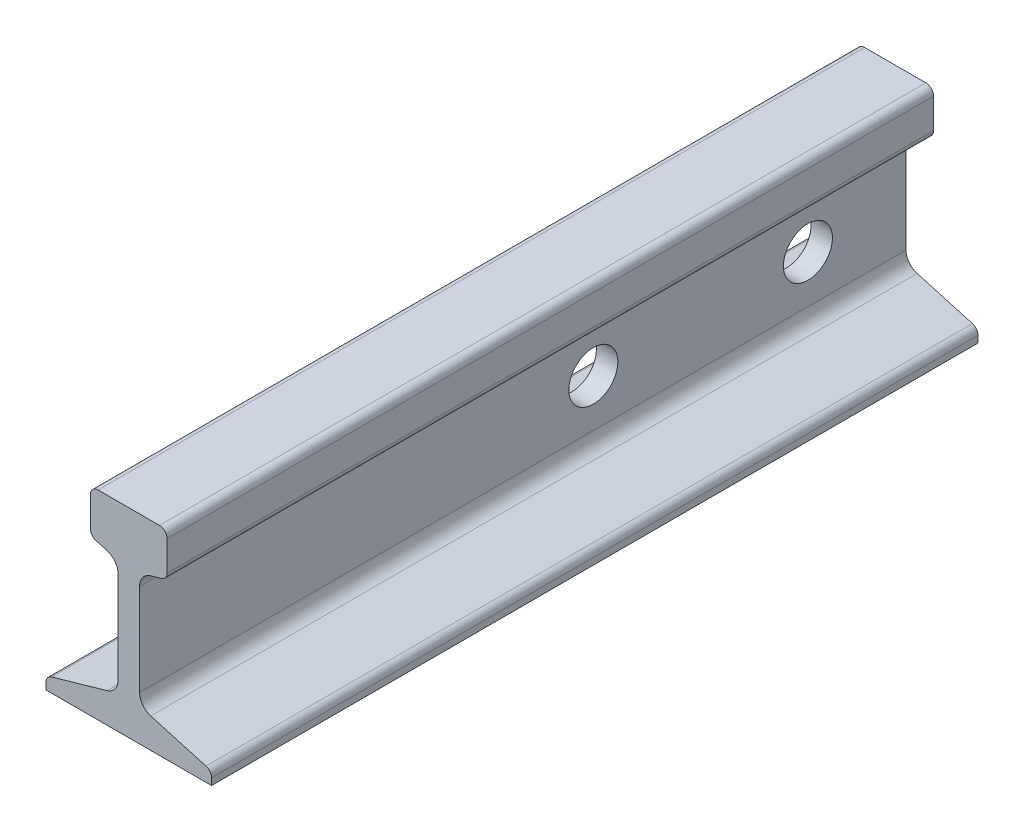
ISO-10303-21;
HEADER;
FILE_DESCRIPTION(('STEP AP214'),'2;1');
FILE_NAME('part.step','',(''),(''),'','','');
FILE_SCHEMA(('AUTOMOTIVE_DESIGN { 1 0 10303 214 1 1 1 1 }'));
ENDSEC;
DATA;
#1=APPLICATION_CONTEXT('core data for automotive mechanical design processes');
#2=APPLICATION_PROTOCOL_DEFINITION('international standard','automotive_design',2000,#1);
#3=PRODUCT_CONTEXT('',#1,'mechanical');
#4=PRODUCT('Part','Part','',(#3));
#5=PRODUCT_RELATED_PRODUCT_CATEGORY('part','',(#4));
#6=PRODUCT_DEFINITION_FORMATION('','',#4);
#7=PRODUCT_DEFINITION_CONTEXT('part definition',#1,'design');
#8=PRODUCT_DEFINITION('design','',#6,#7);
#9=PRODUCT_DEFINITION_SHAPE('','',#8);
#10=(LENGTH_UNIT() NAMED_UNIT(*) SI_UNIT(.MILLI.,.METRE.));
#11=(NAMED_UNIT(*) PLANE_ANGLE_UNIT() SI_UNIT($,.RADIAN.));
#12=(NAMED_UNIT(*) SI_UNIT($,.STERADIAN.) SOLID_ANGLE_UNIT());
#13=UNCERTAINTY_MEASURE_WITH_UNIT(LENGTH_MEASURE(1.E-05),#10,'distance_accuracy_value','');
#14=(GEOMETRIC_REPRESENTATION_CONTEXT(3) GLOBAL_UNCERTAINTY_ASSIGNED_CONTEXT((#13)) GLOBAL_UNIT_ASSIGNED_CONTEXT((#10,
#11,#12)) REPRESENTATION_CONTEXT('',''));
#15=CARTESIAN_POINT('',(0.,0.,0.));
#16=DIRECTION('',(0.,0.,1.));
#17=DIRECTION('',(1.,0.,0.));
#18=AXIS2_PLACEMENT_3D('',#15,#16,#17);
#19=CARTESIAN_POINT('',(37.,62.5,250.));
#20=DIRECTION('',(0.,0.,-1.));
#21=DIRECTION('',(-1.,0.,0.));
#22=AXIS2_PLACEMENT_3D('',#19,#20,#21);
#23=CYLINDRICAL_SURFACE('',#22,2.5);
#24=CARTESIAN_POINT('',(37.,62.5,0.));
#25=DIRECTION('',(0.,0.,1.));
#26=DIRECTION('',(1.,0.,0.));
#27=AXIS2_PLACEMENT_3D('',#24,#25,#26);
#28=CIRCLE('',#27,2.5);
#29=CARTESIAN_POINT('',(39.5,62.5,0.));
#30=VERTEX_POINT('',#29);
#31=CARTESIAN_POINT('',(37.,65.,0.));
#32=VERTEX_POINT('',#31);
#33=EDGE_CURVE('E218',#30,#32,#28,.T.);
#34=ORIENTED_EDGE('',*,*,#33,.T.);
#35=DIRECTION('',(0.,0.,-1.));
#36=VECTOR('',#35,1.);
#37=CARTESIAN_POINT('',(37.,65.,250.));
#38=LINE('',#37,#36);
#39=CARTESIAN_POINT('',(37.,65.,250.));
#40=VERTEX_POINT('',#39);
#41=EDGE_CURVE('E11',#40,#32,#38,.T.);
#42=ORIENTED_EDGE('',*,*,#41,.F.);
#43=CARTESIAN_POINT('',(37.,62.5,250.));
#44=DIRECTION('',(0.,0.,1.));
#45=DIRECTION('',(1.,0.,0.));
#46=AXIS2_PLACEMENT_3D('',#43,#44,#45);
#47=CIRCLE('',#46,2.5);
#48=CARTESIAN_POINT('',(39.5,62.5,250.));
#49=VERTEX_POINT('',#48);
#50=EDGE_CURVE('E133',#49,#40,#47,.T.);
#51=ORIENTED_EDGE('',*,*,#50,.F.);
#52=DIRECTION('',(0.,0.,-1.));
#53=VECTOR('',#52,1.);
#54=CARTESIAN_POINT('',(39.5,62.5,250.));
#55=LINE('',#54,#53);
#56=EDGE_CURVE('E54',#49,#30,#55,.T.);
#57=ORIENTED_EDGE('',*,*,#56,.T.);
#58=EDGE_LOOP('',(#34,#42,#51,#57));
#59=FACE_BOUND('',#58,.T.);
#60=ADVANCED_FACE('F36',(#59),#23,.T.);
#61=CARTESIAN_POINT('',(17.,65.,250.));
#62=DIRECTION('',(0.,1.,0.));
#63=DIRECTION('',(0.,0.,1.));
#64=AXIS2_PLACEMENT_3D('',#61,#62,#63);
#65=PLANE('',#64);
#66=DIRECTION('',(1.,0.,0.));
#67=VECTOR('',#66,1.);
#68=CARTESIAN_POINT('',(17.,65.,0.));
#69=LINE('',#68,#67);
#70=CARTESIAN_POINT('',(17.,65.,0.));
#71=VERTEX_POINT('',#70);
#72=EDGE_CURVE('E220',#71,#32,#69,.T.);
#73=ORIENTED_EDGE('',*,*,#72,.F.);
#74=DIRECTION('',(0.,0.,-1.));
#75=VECTOR('',#74,1.);
#76=CARTESIAN_POINT('',(17.,65.,250.));
#77=LINE('',#76,#75);
#78=CARTESIAN_POINT('',(17.,65.,250.));
#79=VERTEX_POINT('',#78);
#80=EDGE_CURVE('E45',#79,#71,#77,.T.);
#81=ORIENTED_EDGE('',*,*,#80,.F.);
#82=DIRECTION('',(1.,0.,0.));
#83=VECTOR('',#82,1.);
#84=CARTESIAN_POINT('',(17.,65.,250.));
#85=LINE('',#84,#83);
#86=EDGE_CURVE('E329',#79,#40,#85,.T.);
#87=ORIENTED_EDGE('',*,*,#86,.T.);
#88=ORIENTED_EDGE('',*,*,#41,.T.);
#89=EDGE_LOOP('',(#73,#81,#87,#88));
#90=FACE_BOUND('',#89,.T.);
#91=ADVANCED_FACE('F395',(#90),#65,.T.);
#92=CARTESIAN_POINT('',(17.,62.5,250.));
#93=DIRECTION('',(0.,0.,-1.));
#94=DIRECTION('',(-1.,0.,0.));
#95=AXIS2_PLACEMENT_3D('',#92,#93,#94);
#96=CYLINDRICAL_SURFACE('',#95,2.5);
#97=CARTESIAN_POINT('',(17.,62.5,0.));
#98=DIRECTION('',(0.,0.,-1.));
#99=DIRECTION('',(-1.,0.,0.));
#100=AXIS2_PLACEMENT_3D('',#97,#98,#99);
#101=CIRCLE('',#100,2.5);
#102=CARTESIAN_POINT('',(14.5,62.5,0.));
#103=VERTEX_POINT('',#102);
#104=EDGE_CURVE('E224',#103,#71,#101,.T.);
#105=ORIENTED_EDGE('',*,*,#104,.F.);
#106=DIRECTION('',(0.,0.,-1.));
#107=VECTOR('',#106,1.);
#108=CARTESIAN_POINT('',(14.5,62.5,250.));
#109=LINE('',#108,#107);
#110=CARTESIAN_POINT('',(14.5,62.5,250.));
#111=VERTEX_POINT('',#110);
#112=EDGE_CURVE('E313',#111,#103,#109,.T.);
#113=ORIENTED_EDGE('',*,*,#112,.F.);
#114=CARTESIAN_POINT('',(17.,62.5,250.));
#115=DIRECTION('',(0.,0.,-1.));
#116=DIRECTION('',(-1.,0.,0.));
#117=AXIS2_PLACEMENT_3D('',#114,#115,#116);
#118=CIRCLE('',#117,2.5);
#119=EDGE_CURVE('E332',#111,#79,#118,.T.);
#120=ORIENTED_EDGE('',*,*,#119,.T.);
#121=ORIENTED_EDGE('',*,*,#80,.T.);
#122=EDGE_LOOP('',(#105,#113,#120,#121));
#123=FACE_BOUND('',#122,.T.);
#124=ADVANCED_FACE('F399',(#123),#96,.T.);
#125=CARTESIAN_POINT('',(14.5,62.5,250.));
#126=DIRECTION('',(1.,0.,0.));
#127=DIRECTION('',(0.,0.,-1.));
#128=AXIS2_PLACEMENT_3D('',#125,#126,#127);
#129=PLANE('',#128);
#130=DIRECTION('',(0.,-1.,0.));
#131=VECTOR('',#130,1.);
#132=CARTESIAN_POINT('',(14.5,62.5,0.));
#133=LINE('',#132,#131);
#134=CARTESIAN_POINT('',(14.5,52.7447850054955,0.));
#135=VERTEX_POINT('',#134);
#136=EDGE_CURVE('E227',#103,#135,#133,.T.);
#137=ORIENTED_EDGE('',*,*,#136,.T.);
#138=DIRECTION('',(0.,0.,-1.));
#139=VECTOR('',#138,1.);
#140=CARTESIAN_POINT('',(14.5,52.7447850054955,250.));
#141=LINE('',#140,#139);
#142=CARTESIAN_POINT('',(14.5,52.7447850054955,250.));
#143=VERTEX_POINT('',#142);
#144=EDGE_CURVE('E310',#143,#135,#141,.T.);
#145=ORIENTED_EDGE('',*,*,#144,.F.);
#146=DIRECTION('',(0.,-1.,0.));
#147=VECTOR('',#146,1.);
#148=CARTESIAN_POINT('',(14.5,62.5,250.));
#149=LINE('',#148,#147);
#150=EDGE_CURVE('E335',#111,#143,#149,.T.);
#151=ORIENTED_EDGE('',*,*,#150,.F.);
#152=ORIENTED_EDGE('',*,*,#112,.T.);
#153=EDGE_LOOP('',(#137,#145,#151,#152));
#154=FACE_BOUND('',#153,.T.);
#155=ADVANCED_FACE('F409',(#154),#129,.F.);
#156=CARTESIAN_POINT('',(17.,52.7447850054955,250.));
#157=DIRECTION('',(0.,0.,-1.));
#158=DIRECTION('',(-1.,0.,0.));
#159=AXIS2_PLACEMENT_3D('',#156,#157,#158);
#160=CYLINDRICAL_SURFACE('',#159,2.5);
#161=CARTESIAN_POINT('',(17.,52.7447850054955,0.));
#162=DIRECTION('',(0.,0.,1.));
#163=DIRECTION('',(1.,0.,0.));
#164=AXIS2_PLACEMENT_3D('',#161,#162,#163);
#165=CIRCLE('',#164,2.5);
#166=CARTESIAN_POINT('',(16.3131971802566,50.3409751363935,0.));
#167=VERTEX_POINT('',#166);
#168=EDGE_CURVE('E229',#135,#167,#165,.T.);
#169=ORIENTED_EDGE('',*,*,#168,.T.);
#170=DIRECTION('',(0.,0.,-1.));
#171=VECTOR('',#170,1.);
#172=CARTESIAN_POINT('',(16.3131971802566,50.3409751363935,250.));
#173=LINE('',#172,#171);
#174=CARTESIAN_POINT('',(16.3131971802566,50.3409751363935,250.));
#175=VERTEX_POINT('',#174);
#176=EDGE_CURVE('E308',#175,#167,#173,.T.);
#177=ORIENTED_EDGE('',*,*,#176,.F.);
#178=CARTESIAN_POINT('',(17.,52.7447850054955,250.));
#179=DIRECTION('',(0.,0.,1.));
#180=DIRECTION('',(1.,0.,0.));
#181=AXIS2_PLACEMENT_3D('',#178,#179,#180);
#182=CIRCLE('',#181,2.5);
#183=EDGE_CURVE('E337',#143,#175,#182,.T.);
#184=ORIENTED_EDGE('',*,*,#183,.F.);
#185=ORIENTED_EDGE('',*,*,#144,.T.);
#186=EDGE_LOOP('',(#169,#177,#184,#185));
#187=FACE_BOUND('',#186,.T.);
#188=ADVANCED_FACE('F415',(#187),#160,.T.);
#189=CARTESIAN_POINT('',(19.9002970874221,49.3160894486319,250.));
#190=DIRECTION('',(-0.274721127897379,-0.961523947640823,0.));
#191=DIRECTION('',(0.961523947640823,-0.274721127897379,0.));
#192=AXIS2_PLACEMENT_3D('',#189,#190,#191);
#193=PLANE('',#192);
#194=DIRECTION('',(-0.961523947640823,0.274721127897379,0.));
#195=VECTOR('',#194,1.);
#196=CARTESIAN_POINT('',(19.9002970874221,49.3160894486319,0.));
#197=LINE('',#196,#195);
#198=CARTESIAN_POINT('',(19.9002970874221,49.3160894486319,0.));
#199=VERTEX_POINT('',#198);
#200=EDGE_CURVE('E232',#199,#167,#197,.T.);
#201=ORIENTED_EDGE('',*,*,#200,.F.);
#202=DIRECTION('',(0.,0.,-1.));
#203=VECTOR('',#202,1.);
#204=CARTESIAN_POINT('',(19.9002970874221,49.3160894486319,250.));
#205=LINE('',#204,#203);
#206=CARTESIAN_POINT('',(19.9002970874221,49.3160894486319,250.));
#207=VERTEX_POINT('',#206);
#208=EDGE_CURVE('E306',#207,#199,#205,.T.);
#209=ORIENTED_EDGE('',*,*,#208,.F.);
#210=DIRECTION('',(-0.961523947640823,0.274721127897379,0.));
#211=VECTOR('',#210,1.);
#212=CARTESIAN_POINT('',(19.9002970874221,49.3160894486319,250.));
#213=LINE('',#212,#211);
#214=EDGE_CURVE('E339',#207,#175,#213,.T.);
#215=ORIENTED_EDGE('',*,*,#214,.T.);
#216=ORIENTED_EDGE('',*,*,#176,.T.);
#217=EDGE_LOOP('',(#201,#209,#215,#216));
#218=FACE_BOUND('',#217,.T.);
#219=ADVANCED_FACE('F419',(#218),#193,.T.);
#220=CARTESIAN_POINT('',(18.5266914479352,44.5084697104278,250.));
#221=DIRECTION('',(0.,0.,-1.));
#222=DIRECTION('',(-1.,0.,0.));
#223=AXIS2_PLACEMENT_3D('',#220,#221,#222);
#224=CYLINDRICAL_SURFACE('',#223,5.);
#225=CARTESIAN_POINT('',(18.5266914479352,44.5084697104278,0.));
#226=DIRECTION('',(0.,0.,1.));
#227=DIRECTION('',(1.,0.,0.));
#228=AXIS2_PLACEMENT_3D('',#225,#226,#227);
#229=CIRCLE('',#228,5.);
#230=CARTESIAN_POINT('',(23.5266914479352,44.5084697104277,0.));
#231=VERTEX_POINT('',#230);
#232=EDGE_CURVE('E235',#231,#199,#229,.T.);
#233=ORIENTED_EDGE('',*,*,#232,.F.);
#234=DIRECTION('',(0.,0.,-1.));
#235=VECTOR('',#234,1.);
#236=CARTESIAN_POINT('',(23.5266914479352,44.5084697104277,250.));
#237=LINE('',#236,#235);
#238=CARTESIAN_POINT('',(23.5266914479352,44.5084697104277,250.));
#239=VERTEX_POINT('',#238);
#240=EDGE_CURVE('E304',#239,#231,#237,.T.);
#241=ORIENTED_EDGE('',*,*,#240,.F.);
#242=CARTESIAN_POINT('',(18.5266914479352,44.5084697104278,250.));
#243=DIRECTION('',(0.,0.,1.));
#244=DIRECTION('',(1.,0.,0.));
#245=AXIS2_PLACEMENT_3D('',#242,#243,#244);
#246=CIRCLE('',#245,5.);
#247=EDGE_CURVE('E342',#239,#207,#246,.T.);
#248=ORIENTED_EDGE('',*,*,#247,.T.);
#249=ORIENTED_EDGE('',*,*,#208,.T.);
#250=EDGE_LOOP('',(#233,#241,#248,#249));
#251=FACE_BOUND('',#250,.T.);
#252=ADVANCED_FACE('F422',(#251),#224,.F.);
#253=CARTESIAN_POINT('',(23.5266914479352,44.5084697104277,250.));
#254=DIRECTION('',(1.,0.,0.));
#255=DIRECTION('',(0.,0.,-1.));
#256=AXIS2_PLACEMENT_3D('',#253,#254,#255);
#257=PLANE('',#256);
#258=CARTESIAN_POINT('',(23.5266914479352,30.,32.));
#259=DIRECTION('',(1.,0.,0.));
#260=DIRECTION('',(0.,0.,-1.));
#261=AXIS2_PLACEMENT_3D('',#258,#259,#260);
#262=CIRCLE('',#261,8.);
#263=CARTESIAN_POINT('',(23.5266914479352,30.,24.));
#264=VERTEX_POINT('',#263);
#265=EDGE_CURVE('E221',#264,#264,#262,.F.);
#266=ORIENTED_EDGE('',*,*,#265,.F.);
#267=EDGE_LOOP('',(#266));
#268=FACE_BOUND('',#267,.T.);
#269=CARTESIAN_POINT('',(23.5266914479352,30.,102.));
#270=DIRECTION('',(1.,0.,0.));
#271=DIRECTION('',(0.,0.,-1.));
#272=AXIS2_PLACEMENT_3D('',#269,#270,#271);
#273=CIRCLE('',#272,8.);
#274=CARTESIAN_POINT('',(23.5266914479352,30.,94.));
#275=VERTEX_POINT('',#274);
#276=EDGE_CURVE('E317',#275,#275,#273,.F.);
#277=ORIENTED_EDGE('',*,*,#276,.F.);
#278=EDGE_LOOP('',(#277));
#279=FACE_BOUND('',#278,.T.);
#280=DIRECTION('',(0.,-1.,0.));
#281=VECTOR('',#280,1.);
#282=CARTESIAN_POINT('',(23.5266914479352,44.5084697104277,0.));
#283=LINE('',#282,#281);
#284=CARTESIAN_POINT('',(23.5266914479352,14.5721041327756,0.));
#285=VERTEX_POINT('',#284);
#286=EDGE_CURVE('E238',#231,#285,#283,.T.);
#287=ORIENTED_EDGE('',*,*,#286,.T.);
#288=DIRECTION('',(0.,0.,-1.));
#289=VECTOR('',#288,1.);
#290=CARTESIAN_POINT('',(23.5266914479352,14.5721041327756,250.));
#291=LINE('',#290,#289);
#292=CARTESIAN_POINT('',(23.5266914479352,14.5721041327756,250.));
#293=VERTEX_POINT('',#292);
#294=EDGE_CURVE('E301',#293,#285,#291,.T.);
#295=ORIENTED_EDGE('',*,*,#294,.F.);
#296=DIRECTION('',(0.,-1.,0.));
#297=VECTOR('',#296,1.);
#298=CARTESIAN_POINT('',(23.5266914479352,44.5084697104277,250.));
#299=LINE('',#298,#297);
#300=EDGE_CURVE('E345',#239,#293,#299,.T.);
#301=ORIENTED_EDGE('',*,*,#300,.F.);
#302=ORIENTED_EDGE('',*,*,#240,.T.);
#303=EDGE_LOOP('',(#287,#295,#301,#302));
#304=FACE_BOUND('',#303,.T.);
#305=ADVANCED_FACE('F428',(#268,#279,#304),#257,.F.);
#306=CARTESIAN_POINT('',(18.5266914479352,14.5721041327756,250.));
#307=DIRECTION('',(0.,0.,-1.));
#308=DIRECTION('',(-1.,0.,0.));
#309=AXIS2_PLACEMENT_3D('',#306,#307,#308);
#310=CYLINDRICAL_SURFACE('',#309,5.);
#311=CARTESIAN_POINT('',(18.5266914479352,14.5721041327756,0.));
#312=DIRECTION('',(0.,0.,-1.));
#313=DIRECTION('',(-1.,0.,0.));
#314=AXIS2_PLACEMENT_3D('',#311,#312,#313);
#315=CIRCLE('',#314,5.);
#316=CARTESIAN_POINT('',(19.9002970874221,9.76448439457145,0.));
#317=VERTEX_POINT('',#316);
#318=EDGE_CURVE('E240',#285,#317,#315,.T.);
#319=ORIENTED_EDGE('',*,*,#318,.T.);
#320=DIRECTION('',(0.,0.,-1.));
#321=VECTOR('',#320,1.);
#322=CARTESIAN_POINT('',(19.9002970874221,9.76448439457145,250.));
#323=LINE('',#322,#321);
#324=CARTESIAN_POINT('',(19.9002970874221,9.76448439457145,250.));
#325=VERTEX_POINT('',#324);
#326=EDGE_CURVE('E298',#325,#317,#323,.T.);
#327=ORIENTED_EDGE('',*,*,#326,.F.);
#328=CARTESIAN_POINT('',(18.5266914479352,14.5721041327756,250.));
#329=DIRECTION('',(0.,0.,-1.));
#330=DIRECTION('',(-1.,0.,0.));
#331=AXIS2_PLACEMENT_3D('',#328,#329,#330);
#332=CIRCLE('',#331,5.);
#333=EDGE_CURVE('E347',#293,#325,#332,.T.);
#334=ORIENTED_EDGE('',*,*,#333,.F.);
#335=ORIENTED_EDGE('',*,*,#294,.T.);
#336=EDGE_LOOP('',(#319,#327,#334,#335));
#337=FACE_BOUND('',#336,.T.);
#338=ADVANCED_FACE('F432',(#337),#310,.F.);
#339=CARTESIAN_POINT('',(19.9002970874221,9.76448439457145,250.));
#340=DIRECTION('',(0.274721127897379,-0.961523947640823,0.));
#341=DIRECTION('',(0.961523947640823,0.274721127897379,0.));
#342=AXIS2_PLACEMENT_3D('',#339,#340,#341);
#343=PLANE('',#342);
#344=DIRECTION('',(-0.961523947640823,-0.274721127897379,0.));
#345=VECTOR('',#344,1.);
#346=CARTESIAN_POINT('',(19.9002970874221,9.76448439457145,0.));
#347=LINE('',#346,#345);
#348=CARTESIAN_POINT('',(1.81319718025657,4.59674156395273,0.));
#349=VERTEX_POINT('',#348);
#350=EDGE_CURVE('E242',#317,#349,#347,.T.);
#351=ORIENTED_EDGE('',*,*,#350,.T.);
#352=DIRECTION('',(0.,0.,-1.));
#353=VECTOR('',#352,1.);
#354=CARTESIAN_POINT('',(1.81319718025657,4.59674156395273,250.));
#355=LINE('',#354,#353);
#356=CARTESIAN_POINT('',(1.81319718025657,4.59674156395273,250.));
#357=VERTEX_POINT('',#356);
#358=EDGE_CURVE('E295',#357,#349,#355,.T.);
#359=ORIENTED_EDGE('',*,*,#358,.F.);
#360=DIRECTION('',(-0.961523947640823,-0.274721127897379,0.));
#361=VECTOR('',#360,1.);
#362=CARTESIAN_POINT('',(19.9002970874221,9.76448439457145,250.));
#363=LINE('',#362,#361);
#364=EDGE_CURVE('E349',#325,#357,#363,.T.);
#365=ORIENTED_EDGE('',*,*,#364,.F.);
#366=ORIENTED_EDGE('',*,*,#326,.T.);
#367=EDGE_LOOP('',(#351,#359,#365,#366));
#368=FACE_BOUND('',#367,.T.);
#369=ADVANCED_FACE('F437',(#368),#343,.F.);
#370=CARTESIAN_POINT('',(2.5,2.19293169485067,250.));
#371=DIRECTION('',(0.,0.,-1.));
#372=DIRECTION('',(-1.,0.,0.));
#373=AXIS2_PLACEMENT_3D('',#370,#371,#372);
#374=CYLINDRICAL_SURFACE('',#373,2.5);
#375=CARTESIAN_POINT('',(2.5,2.19293169485067,0.));
#376=DIRECTION('',(0.,0.,1.));
#377=DIRECTION('',(1.,0.,0.));
#378=AXIS2_PLACEMENT_3D('',#375,#376,#377);
#379=CIRCLE('',#378,2.5);
#380=CARTESIAN_POINT('',(0.,2.19293169485066,0.));
#381=VERTEX_POINT('',#380);
#382=EDGE_CURVE('E244',#349,#381,#379,.T.);
#383=ORIENTED_EDGE('',*,*,#382,.T.);
#384=DIRECTION('',(0.,0.,-1.));
#385=VECTOR('',#384,1.);
#386=CARTESIAN_POINT('',(0.,2.19293169485066,250.));
#387=LINE('',#386,#385);
#388=CARTESIAN_POINT('',(0.,2.19293169485066,250.));
#389=VERTEX_POINT('',#388);
#390=EDGE_CURVE('E293',#389,#381,#387,.T.);
#391=ORIENTED_EDGE('',*,*,#390,.F.);
#392=CARTESIAN_POINT('',(2.5,2.19293169485067,250.));
#393=DIRECTION('',(0.,0.,1.));
#394=DIRECTION('',(1.,0.,0.));
#395=AXIS2_PLACEMENT_3D('',#392,#393,#394);
#396=CIRCLE('',#395,2.5);
#397=EDGE_CURVE('E351',#357,#389,#396,.T.);
#398=ORIENTED_EDGE('',*,*,#397,.F.);
#399=ORIENTED_EDGE('',*,*,#358,.T.);
#400=EDGE_LOOP('',(#383,#391,#398,#399));
#401=FACE_BOUND('',#400,.T.);
#402=ADVANCED_FACE('F442',(#401),#374,.T.);
#403=CARTESIAN_POINT('',(0.,0.,250.));
#404=DIRECTION('',(-1.,0.,0.));
#405=DIRECTION('',(0.,0.,1.));
#406=AXIS2_PLACEMENT_3D('',#403,#404,#405);
#407=PLANE('',#406);
#408=DIRECTION('',(0.,1.,0.));
#409=VECTOR('',#408,1.);
#410=CARTESIAN_POINT('',(0.,0.,0.));
#411=LINE('',#410,#409);
#412=CARTESIAN_POINT('',(0.,0.,0.));
#413=VERTEX_POINT('',#412);
#414=EDGE_CURVE('E247',#413,#381,#411,.T.);
#415=ORIENTED_EDGE('',*,*,#414,.F.);
#416=DIRECTION('',(0.,0.,-1.));
#417=VECTOR('',#416,1.);
#418=CARTESIAN_POINT('',(0.,0.,250.));
#419=LINE('',#418,#417);
#420=CARTESIAN_POINT('',(0.,0.,250.));
#421=VERTEX_POINT('',#420);
#422=EDGE_CURVE('E291',#421,#413,#419,.T.);
#423=ORIENTED_EDGE('',*,*,#422,.F.);
#424=DIRECTION('',(0.,1.,0.));
#425=VECTOR('',#424,1.);
#426=CARTESIAN_POINT('',(0.,0.,250.));
#427=LINE('',#426,#425);
#428=EDGE_CURVE('E353',#421,#389,#427,.T.);
#429=ORIENTED_EDGE('',*,*,#428,.T.);
#430=ORIENTED_EDGE('',*,*,#390,.T.);
#431=EDGE_LOOP('',(#415,#423,#429,#430));
#432=FACE_BOUND('',#431,.T.);
#433=ADVANCED_FACE('F446',(#432),#407,.T.);
#434=CARTESIAN_POINT('',(0.,0.,250.));
#435=DIRECTION('',(0.,1.,0.));
#436=DIRECTION('',(0.,0.,1.));
#437=AXIS2_PLACEMENT_3D('',#434,#435,#436);
#438=PLANE('',#437);
#439=DIRECTION('',(1.,0.,0.));
#440=VECTOR('',#439,1.);
#441=CARTESIAN_POINT('',(0.,0.,0.));
#442=LINE('',#441,#440);
#443=CARTESIAN_POINT('',(54.,0.,0.));
#444=VERTEX_POINT('',#443);
#445=EDGE_CURVE('E250',#413,#444,#442,.T.);
#446=ORIENTED_EDGE('',*,*,#445,.T.);
#447=DIRECTION('',(0.,0.,-1.));
#448=VECTOR('',#447,1.);
#449=CARTESIAN_POINT('',(54.,0.,250.));
#450=LINE('',#449,#448);
#451=CARTESIAN_POINT('',(54.,0.,250.));
#452=VERTEX_POINT('',#451);
#453=EDGE_CURVE('E289',#452,#444,#450,.T.);
#454=ORIENTED_EDGE('',*,*,#453,.F.);
#455=DIRECTION('',(1.,0.,0.));
#456=VECTOR('',#455,1.);
#457=CARTESIAN_POINT('',(0.,0.,250.));
#458=LINE('',#457,#456);
#459=EDGE_CURVE('E356',#421,#452,#458,.T.);
#460=ORIENTED_EDGE('',*,*,#459,.F.);
#461=ORIENTED_EDGE('',*,*,#422,.T.);
#462=EDGE_LOOP('',(#446,#454,#460,#461));
#463=FACE_BOUND('',#462,.T.);
#464=ADVANCED_FACE('F451',(#463),#438,.F.);
#465=CARTESIAN_POINT('',(54.,2.19293169485066,250.));
#466=DIRECTION('',(1.,0.,0.));
#467=DIRECTION('',(0.,0.,-1.));
#468=AXIS2_PLACEMENT_3D('',#465,#466,#467);
#469=PLANE('',#468);
#470=DIRECTION('',(0.,-1.,0.));
#471=VECTOR('',#470,1.);
#472=CARTESIAN_POINT('',(54.,2.19293169485066,0.));
#473=LINE('',#472,#471);
#474=CARTESIAN_POINT('',(54.,2.19293169485066,0.));
#475=VERTEX_POINT('',#474);
#476=EDGE_CURVE('E253',#475,#444,#473,.T.);
#477=ORIENTED_EDGE('',*,*,#476,.F.);
#478=DIRECTION('',(0.,0.,-1.));
#479=VECTOR('',#478,1.);
#480=CARTESIAN_POINT('',(54.,2.19293169485066,250.));
#481=LINE('',#480,#479);
#482=CARTESIAN_POINT('',(54.,2.19293169485066,250.));
#483=VERTEX_POINT('',#482);
#484=EDGE_CURVE('E287',#483,#475,#481,.T.);
#485=ORIENTED_EDGE('',*,*,#484,.F.);
#486=DIRECTION('',(0.,-1.,0.));
#487=VECTOR('',#486,1.);
#488=CARTESIAN_POINT('',(54.,2.19293169485066,250.));
#489=LINE('',#488,#487);
#490=EDGE_CURVE('E358',#483,#452,#489,.T.);
#491=ORIENTED_EDGE('',*,*,#490,.T.);
#492=ORIENTED_EDGE('',*,*,#453,.T.);
#493=EDGE_LOOP('',(#477,#485,#491,#492));
#494=FACE_BOUND('',#493,.T.);
#495=ADVANCED_FACE('F457',(#494),#469,.T.);
#496=CARTESIAN_POINT('',(51.5,2.19293169485067,250.));
#497=DIRECTION('',(0.,0.,-1.));
#498=DIRECTION('',(-1.,0.,0.));
#499=AXIS2_PLACEMENT_3D('',#496,#497,#498);
#500=CYLINDRICAL_SURFACE('',#499,2.5);
#501=CARTESIAN_POINT('',(51.5,2.19293169485067,0.));
#502=DIRECTION('',(0.,0.,1.));
#503=DIRECTION('',(1.,0.,0.));
#504=AXIS2_PLACEMENT_3D('',#501,#502,#503);
#505=CIRCLE('',#504,2.5);
#506=CARTESIAN_POINT('',(52.1868028197434,4.59674156395273,0.));
#507=VERTEX_POINT('',#506);
#508=EDGE_CURVE('E256',#475,#507,#505,.T.);
#509=ORIENTED_EDGE('',*,*,#508,.T.);
#510=DIRECTION('',(0.,0.,-1.));
#511=VECTOR('',#510,1.);
#512=CARTESIAN_POINT('',(52.1868028197434,4.59674156395273,250.));
#513=LINE('',#512,#511);
#514=CARTESIAN_POINT('',(52.1868028197434,4.59674156395273,250.));
#515=VERTEX_POINT('',#514);
#516=EDGE_CURVE('E285',#515,#507,#513,.T.);
#517=ORIENTED_EDGE('',*,*,#516,.F.);
#518=CARTESIAN_POINT('',(51.5,2.19293169485067,250.));
#519=DIRECTION('',(0.,0.,1.));
#520=DIRECTION('',(1.,0.,0.));
#521=AXIS2_PLACEMENT_3D('',#518,#519,#520);
#522=CIRCLE('',#521,2.5);
#523=EDGE_CURVE('E361',#483,#515,#522,.T.);
#524=ORIENTED_EDGE('',*,*,#523,.F.);
#525=ORIENTED_EDGE('',*,*,#484,.T.);
#526=EDGE_LOOP('',(#509,#517,#524,#525));
#527=FACE_BOUND('',#526,.T.);
#528=ADVANCED_FACE('F460',(#527),#500,.T.);
#529=CARTESIAN_POINT('',(34.1530858084483,9.74923213860849,250.));
#530=DIRECTION('',(0.274721127897379,0.961523947640823,0.));
#531=DIRECTION('',(-0.961523947640823,0.274721127897379,0.));
#532=AXIS2_PLACEMENT_3D('',#529,#530,#531);
#533=PLANE('',#532);
#534=DIRECTION('',(0.961523947640823,-0.274721127897379,0.));
#535=VECTOR('',#534,1.);
#536=CARTESIAN_POINT('',(34.1530858084483,9.74923213860849,0.));
#537=LINE('',#536,#535);
#538=CARTESIAN_POINT('',(34.1530858084483,9.74923213860849,0.));
#539=VERTEX_POINT('',#538);
#540=EDGE_CURVE('E259',#539,#507,#537,.T.);
#541=ORIENTED_EDGE('',*,*,#540,.F.);
#542=DIRECTION('',(0.,0.,-1.));
#543=VECTOR('',#542,1.);
#544=CARTESIAN_POINT('',(34.1530858084483,9.74923213860849,250.));
#545=LINE('',#544,#543);
#546=CARTESIAN_POINT('',(34.1530858084483,9.74923213860849,250.));
#547=VERTEX_POINT('',#546);
#548=EDGE_CURVE('E283',#547,#539,#545,.T.);
#549=ORIENTED_EDGE('',*,*,#548,.F.);
#550=DIRECTION('',(0.961523947640823,-0.274721127897379,0.));
#551=VECTOR('',#550,1.);
#552=CARTESIAN_POINT('',(34.1530858084483,9.74923213860849,250.));
#553=LINE('',#552,#551);
#554=EDGE_CURVE('E363',#547,#515,#553,.T.);
#555=ORIENTED_EDGE('',*,*,#554,.T.);
#556=ORIENTED_EDGE('',*,*,#516,.T.);
#557=EDGE_LOOP('',(#541,#549,#555,#556));
#558=FACE_BOUND('',#557,.T.);
#559=ADVANCED_FACE('F462',(#558),#533,.T.);
#560=CARTESIAN_POINT('',(35.5266914479352,14.5568518768126,250.));
#561=DIRECTION('',(0.,0.,-1.));
#562=DIRECTION('',(-1.,0.,0.));
#563=AXIS2_PLACEMENT_3D('',#560,#561,#562);
#564=CYLINDRICAL_SURFACE('',#563,5.);
#565=CARTESIAN_POINT('',(35.5266914479352,14.5568518768126,0.));
#566=DIRECTION('',(0.,0.,-1.));
#567=DIRECTION('',(-1.,0.,0.));
#568=AXIS2_PLACEMENT_3D('',#565,#566,#567);
#569=CIRCLE('',#568,5.);
#570=CARTESIAN_POINT('',(30.5266914479352,14.5568518768126,0.));
#571=VERTEX_POINT('',#570);
#572=EDGE_CURVE('E262',#539,#571,#569,.T.);
#573=ORIENTED_EDGE('',*,*,#572,.T.);
#574=DIRECTION('',(0.,0.,-1.));
#575=VECTOR('',#574,1.);
#576=CARTESIAN_POINT('',(30.5266914479352,14.5568518768126,250.));
#577=LINE('',#576,#575);
#578=CARTESIAN_POINT('',(30.5266914479352,14.5568518768126,250.));
#579=VERTEX_POINT('',#578);
#580=EDGE_CURVE('E281',#579,#571,#577,.T.);
#581=ORIENTED_EDGE('',*,*,#580,.F.);
#582=CARTESIAN_POINT('',(35.5266914479352,14.5568518768126,250.));
#583=DIRECTION('',(0.,0.,-1.));
#584=DIRECTION('',(-1.,0.,0.));
#585=AXIS2_PLACEMENT_3D('',#582,#583,#584);
#586=CIRCLE('',#585,5.);
#587=EDGE_CURVE('E366',#547,#579,#586,.T.);
#588=ORIENTED_EDGE('',*,*,#587,.F.);
#589=ORIENTED_EDGE('',*,*,#548,.T.);
#590=EDGE_LOOP('',(#573,#581,#588,#589));
#591=FACE_BOUND('',#590,.T.);
#592=ADVANCED_FACE('F377',(#591),#564,.F.);
#593=CARTESIAN_POINT('',(30.5266914479352,44.5237219663907,250.));
#594=DIRECTION('',(1.,0.,0.));
#595=DIRECTION('',(0.,1.,0.));
#596=AXIS2_PLACEMENT_3D('',#593,#594,#595);
#597=PLANE('',#596);
#598=CARTESIAN_POINT('',(30.5266914479352,30.,32.));
#599=DIRECTION('',(1.,0.,0.));
#600=DIRECTION('',(0.,1.,0.));
#601=AXIS2_PLACEMENT_3D('',#598,#599,#600);
#602=CIRCLE('',#601,8.);
#603=CARTESIAN_POINT('',(30.5266914479352,38.,32.));
#604=VERTEX_POINT('',#603);
#605=EDGE_CURVE('E39',#604,#604,#602,.F.);
#606=ORIENTED_EDGE('',*,*,#605,.T.);
#607=EDGE_LOOP('',(#606));
#608=FACE_BOUND('',#607,.T.);
#609=CARTESIAN_POINT('',(30.5266914479352,30.,102.));
#610=DIRECTION('',(1.,0.,0.));
#611=DIRECTION('',(0.,1.,0.));
#612=AXIS2_PLACEMENT_3D('',#609,#610,#611);
#613=CIRCLE('',#612,8.);
#614=CARTESIAN_POINT('',(30.5266914479352,38.,102.));
#615=VERTEX_POINT('',#614);
#616=EDGE_CURVE('E315',#615,#615,#613,.F.);
#617=ORIENTED_EDGE('',*,*,#616,.T.);
#618=EDGE_LOOP('',(#617));
#619=FACE_BOUND('',#618,.T.);
#620=DIRECTION('',(0.,-1.,0.));
#621=VECTOR('',#620,1.);
#622=CARTESIAN_POINT('',(30.5266914479352,44.5237219663907,0.));
#623=LINE('',#622,#621);
#624=CARTESIAN_POINT('',(30.5266914479352,44.5237219663907,0.));
#625=VERTEX_POINT('',#624);
#626=EDGE_CURVE('E265',#625,#571,#623,.T.);
#627=ORIENTED_EDGE('',*,*,#626,.F.);
#628=DIRECTION('',(0.,0.,-1.));
#629=VECTOR('',#628,1.);
#630=CARTESIAN_POINT('',(30.5266914479352,44.5237219663907,250.));
#631=LINE('',#630,#629);
#632=CARTESIAN_POINT('',(30.5266914479352,44.5237219663907,250.));
#633=VERTEX_POINT('',#632);
#634=EDGE_CURVE('E279',#633,#625,#631,.T.);
#635=ORIENTED_EDGE('',*,*,#634,.F.);
#636=DIRECTION('',(0.,-1.,0.));
#637=VECTOR('',#636,1.);
#638=CARTESIAN_POINT('',(30.5266914479352,44.5237219663907,250.));
#639=LINE('',#638,#637);
#640=EDGE_CURVE('E368',#633,#579,#639,.T.);
#641=ORIENTED_EDGE('',*,*,#640,.T.);
#642=ORIENTED_EDGE('',*,*,#580,.T.);
#643=EDGE_LOOP('',(#627,#635,#641,#642));
#644=FACE_BOUND('',#643,.T.);
#645=ADVANCED_FACE('F372',(#608,#619,#644),#597,.T.);
#646=CARTESIAN_POINT('',(35.5266914479352,44.5237219663907,250.));
#647=DIRECTION('',(0.,0.,-1.));
#648=DIRECTION('',(-1.,0.,0.));
#649=AXIS2_PLACEMENT_3D('',#646,#647,#648);
#650=CYLINDRICAL_SURFACE('',#649,5.);
#651=CARTESIAN_POINT('',(35.5266914479352,44.5237219663907,0.));
#652=DIRECTION('',(0.,0.,-1.));
#653=DIRECTION('',(-1.,0.,0.));
#654=AXIS2_PLACEMENT_3D('',#651,#652,#653);
#655=CIRCLE('',#654,5.);
#656=CARTESIAN_POINT('',(34.1530858084483,49.3313417045948,0.));
#657=VERTEX_POINT('',#656);
#658=EDGE_CURVE('E268',#625,#657,#655,.T.);
#659=ORIENTED_EDGE('',*,*,#658,.T.);
#660=DIRECTION('',(0.,0.,-1.));
#661=VECTOR('',#660,1.);
#662=CARTESIAN_POINT('',(34.1530858084483,49.3313417045948,250.));
#663=LINE('',#662,#661);
#664=CARTESIAN_POINT('',(34.1530858084483,49.3313417045948,250.));
#665=VERTEX_POINT('',#664);
#666=EDGE_CURVE('E210',#665,#657,#663,.T.);
#667=ORIENTED_EDGE('',*,*,#666,.F.);
#668=CARTESIAN_POINT('',(35.5266914479352,44.5237219663907,250.));
#669=DIRECTION('',(0.,0.,-1.));
#670=DIRECTION('',(-1.,0.,0.));
#671=AXIS2_PLACEMENT_3D('',#668,#669,#670);
#672=CIRCLE('',#671,5.);
#673=EDGE_CURVE('E198',#633,#665,#672,.T.);
#674=ORIENTED_EDGE('',*,*,#673,.F.);
#675=ORIENTED_EDGE('',*,*,#634,.T.);
#676=EDGE_LOOP('',(#659,#667,#674,#675));
#677=FACE_BOUND('',#676,.T.);
#678=ADVANCED_FACE('F384',(#677),#650,.F.);
#679=CARTESIAN_POINT('',(34.1530858084483,49.3313417045948,250.));
#680=DIRECTION('',(-0.27472112789738,0.961523947640823,0.));
#681=DIRECTION('',(-0.961523947640823,-0.27472112789738,0.));
#682=AXIS2_PLACEMENT_3D('',#679,#680,#681);
#683=PLANE('',#682);
#684=DIRECTION('',(0.961523947640823,0.27472112789738,0.));
#685=VECTOR('',#684,1.);
#686=CARTESIAN_POINT('',(34.1530858084483,49.3313417045948,0.));
#687=LINE('',#686,#685);
#688=CARTESIAN_POINT('',(37.6868028197434,50.3409751363935,0.));
#689=VERTEX_POINT('',#688);
#690=EDGE_CURVE('E207',#657,#689,#687,.T.);
#691=ORIENTED_EDGE('',*,*,#690,.T.);
#692=DIRECTION('',(0.,0.,-1.));
#693=VECTOR('',#692,1.);
#694=CARTESIAN_POINT('',(37.6868028197434,50.3409751363935,250.));
#695=LINE('',#694,#693);
#696=CARTESIAN_POINT('',(37.6868028197434,50.3409751363935,250.));
#697=VERTEX_POINT('',#696);
#698=EDGE_CURVE('E204',#697,#689,#695,.T.);
#699=ORIENTED_EDGE('',*,*,#698,.F.);
#700=DIRECTION('',(0.961523947640823,0.27472112789738,0.));
#701=VECTOR('',#700,1.);
#702=CARTESIAN_POINT('',(34.1530858084483,49.3313417045948,250.));
#703=LINE('',#702,#701);
#704=EDGE_CURVE('E191',#665,#697,#703,.T.);
#705=ORIENTED_EDGE('',*,*,#704,.F.);
#706=ORIENTED_EDGE('',*,*,#666,.T.);
#707=EDGE_LOOP('',(#691,#699,#705,#706));
#708=FACE_BOUND('',#707,.T.);
#709=ADVANCED_FACE('F205',(#708),#683,.F.);
#710=CARTESIAN_POINT('',(37.,52.7447850054955,250.));
#711=DIRECTION('',(0.,0.,-1.));
#712=DIRECTION('',(-1.,0.,0.));
#713=AXIS2_PLACEMENT_3D('',#710,#711,#712);
#714=CYLINDRICAL_SURFACE('',#713,2.5);
#715=CARTESIAN_POINT('',(37.,52.7447850054955,0.));
#716=DIRECTION('',(0.,0.,-1.));
#717=DIRECTION('',(-1.,0.,0.));
#718=AXIS2_PLACEMENT_3D('',#715,#716,#717);
#719=CIRCLE('',#718,2.5);
#720=CARTESIAN_POINT('',(39.5,52.7447850054955,0.));
#721=VERTEX_POINT('',#720);
#722=EDGE_CURVE('E271',#721,#689,#719,.T.);
#723=ORIENTED_EDGE('',*,*,#722,.F.);
#724=DIRECTION('',(0.,0.,-1.));
#725=VECTOR('',#724,1.);
#726=CARTESIAN_POINT('',(39.5,52.7447850054955,250.));
#727=LINE('',#726,#725);
#728=CARTESIAN_POINT('',(39.5,52.7447850054955,250.));
#729=VERTEX_POINT('',#728);
#730=EDGE_CURVE('E121',#729,#721,#727,.T.);
#731=ORIENTED_EDGE('',*,*,#730,.F.);
#732=CARTESIAN_POINT('',(37.,52.7447850054955,250.));
#733=DIRECTION('',(0.,0.,-1.));
#734=DIRECTION('',(-1.,0.,0.));
#735=AXIS2_PLACEMENT_3D('',#732,#733,#734);
#736=CIRCLE('',#735,2.5);
#737=EDGE_CURVE('E195',#729,#697,#736,.T.);
#738=ORIENTED_EDGE('',*,*,#737,.T.);
#739=ORIENTED_EDGE('',*,*,#698,.T.);
#740=EDGE_LOOP('',(#723,#731,#738,#739));
#741=FACE_BOUND('',#740,.T.);
#742=ADVANCED_FACE('F212',(#741),#714,.T.);
#743=CARTESIAN_POINT('',(39.5,62.5,250.));
#744=DIRECTION('',(1.,0.,0.));
#745=DIRECTION('',(0.,0.,-1.));
#746=AXIS2_PLACEMENT_3D('',#743,#744,#745);
#747=PLANE('',#746);
#748=DIRECTION('',(0.,-1.,0.));
#749=VECTOR('',#748,1.);
#750=CARTESIAN_POINT('',(39.5,62.5,0.));
#751=LINE('',#750,#749);
#752=EDGE_CURVE('E273',#30,#721,#751,.T.);
#753=ORIENTED_EDGE('',*,*,#752,.F.);
#754=ORIENTED_EDGE('',*,*,#56,.F.);
#755=DIRECTION('',(0.,-1.,0.));
#756=VECTOR('',#755,1.);
#757=CARTESIAN_POINT('',(39.5,62.5,250.));
#758=LINE('',#757,#756);
#759=EDGE_CURVE('E213',#49,#729,#758,.T.);
#760=ORIENTED_EDGE('',*,*,#759,.T.);
#761=ORIENTED_EDGE('',*,*,#730,.T.);
#762=EDGE_LOOP('',(#753,#754,#760,#761));
#763=FACE_BOUND('',#762,.T.);
#764=ADVANCED_FACE('F580',(#763),#747,.T.);
#765=CARTESIAN_POINT('',(37.,62.5,250.));
#766=DIRECTION('',(0.,0.,1.));
#767=DIRECTION('',(1.,0.,0.));
#768=AXIS2_PLACEMENT_3D('',#765,#766,#767);
#769=PLANE('',#768);
#770=ORIENTED_EDGE('',*,*,#50,.T.);
#771=ORIENTED_EDGE('',*,*,#86,.F.);
#772=ORIENTED_EDGE('',*,*,#119,.F.);
#773=ORIENTED_EDGE('',*,*,#150,.T.);
#774=ORIENTED_EDGE('',*,*,#183,.T.);
#775=ORIENTED_EDGE('',*,*,#214,.F.);
#776=ORIENTED_EDGE('',*,*,#247,.F.);
#777=ORIENTED_EDGE('',*,*,#300,.T.);
#778=ORIENTED_EDGE('',*,*,#333,.T.);
#779=ORIENTED_EDGE('',*,*,#364,.T.);
#780=ORIENTED_EDGE('',*,*,#397,.T.);
#781=ORIENTED_EDGE('',*,*,#428,.F.);
#782=ORIENTED_EDGE('',*,*,#459,.T.);
#783=ORIENTED_EDGE('',*,*,#490,.F.);
#784=ORIENTED_EDGE('',*,*,#523,.T.);
#785=ORIENTED_EDGE('',*,*,#554,.F.);
#786=ORIENTED_EDGE('',*,*,#587,.T.);
#787=ORIENTED_EDGE('',*,*,#640,.F.);
#788=ORIENTED_EDGE('',*,*,#673,.T.);
#789=ORIENTED_EDGE('',*,*,#704,.T.);
#790=ORIENTED_EDGE('',*,*,#737,.F.);
#791=ORIENTED_EDGE('',*,*,#759,.F.);
#792=EDGE_LOOP('',(#770,#771,#772,#773,#774,#775,#776,#777,#778,#779,#780,#781,#782,#783,#784,
#785,#786,#787,#788,#789,#790,#791));
#793=FACE_BOUND('',#792,.T.);
#794=ADVANCED_FACE('F193',(#793),#769,.T.);
#795=CARTESIAN_POINT('',(37.,62.5,0.));
#796=DIRECTION('',(0.,0.,1.));
#797=DIRECTION('',(1.,0.,0.));
#798=AXIS2_PLACEMENT_3D('',#795,#796,#797);
#799=PLANE('',#798);
#800=ORIENTED_EDGE('',*,*,#33,.F.);
#801=ORIENTED_EDGE('',*,*,#752,.T.);
#802=ORIENTED_EDGE('',*,*,#722,.T.);
#803=ORIENTED_EDGE('',*,*,#690,.F.);
#804=ORIENTED_EDGE('',*,*,#658,.F.);
#805=ORIENTED_EDGE('',*,*,#626,.T.);
#806=ORIENTED_EDGE('',*,*,#572,.F.);
#807=ORIENTED_EDGE('',*,*,#540,.T.);
#808=ORIENTED_EDGE('',*,*,#508,.F.);
#809=ORIENTED_EDGE('',*,*,#476,.T.);
#810=ORIENTED_EDGE('',*,*,#445,.F.);
#811=ORIENTED_EDGE('',*,*,#414,.T.);
#812=ORIENTED_EDGE('',*,*,#382,.F.);
#813=ORIENTED_EDGE('',*,*,#350,.F.);
#814=ORIENTED_EDGE('',*,*,#318,.F.);
#815=ORIENTED_EDGE('',*,*,#286,.F.);
#816=ORIENTED_EDGE('',*,*,#232,.T.);
#817=ORIENTED_EDGE('',*,*,#200,.T.);
#818=ORIENTED_EDGE('',*,*,#168,.F.);
#819=ORIENTED_EDGE('',*,*,#136,.F.);
#820=ORIENTED_EDGE('',*,*,#104,.T.);
#821=ORIENTED_EDGE('',*,*,#72,.T.);
#822=EDGE_LOOP('',(#800,#801,#802,#803,#804,#805,#806,#807,#808,#809,#810,#811,#812,#813,#814,
#815,#816,#817,#818,#819,#820,#821));
#823=FACE_BOUND('',#822,.T.);
#824=ADVANCED_FACE('F382',(#823),#799,.F.);
#825=CARTESIAN_POINT('',(40.,30.,102.));
#826=DIRECTION('',(-1.,0.,0.));
#827=DIRECTION('',(0.,0.,1.));
#828=AXIS2_PLACEMENT_3D('',#825,#826,#827);
#829=CYLINDRICAL_SURFACE('',#828,8.);
#830=ORIENTED_EDGE('',*,*,#616,.F.);
#831=EDGE_LOOP('',(#830));
#832=FACE_BOUND('',#831,.T.);
#833=ORIENTED_EDGE('',*,*,#276,.T.);
#834=EDGE_LOOP('',(#833));
#835=FACE_BOUND('',#834,.T.);
#836=ADVANCED_FACE('F603',(#832,#835),#829,.F.);
#837=CARTESIAN_POINT('',(40.,30.,32.));
#838=DIRECTION('',(-1.,0.,0.));
#839=DIRECTION('',(0.,0.,1.));
#840=AXIS2_PLACEMENT_3D('',#837,#838,#839);
#841=CYLINDRICAL_SURFACE('',#840,8.);
#842=ORIENTED_EDGE('',*,*,#605,.F.);
#843=EDGE_LOOP('',(#842));
#844=FACE_BOUND('',#843,.T.);
#845=ORIENTED_EDGE('',*,*,#265,.T.);
#846=EDGE_LOOP('',(#845));
#847=FACE_BOUND('',#846,.T.);
#848=ADVANCED_FACE('F613',(#844,#847),#841,.F.);
#849=CLOSED_SHELL('',(#60,#91,#124,#155,#188,#219,#252,#305,#338,#369,#402,#433,#464,#495,#528,
#559,#592,#645,#678,#709,#742,#764,#794,#824,#836,#848));
#850=MANIFOLD_SOLID_BREP('B2',#849);
#851=ADVANCED_BREP_SHAPE_REPRESENTATION('',(#18,#850),#14);
#852=SHAPE_DEFINITION_REPRESENTATION(#9,#851);
ENDSEC;
END-ISO-10303-21;
